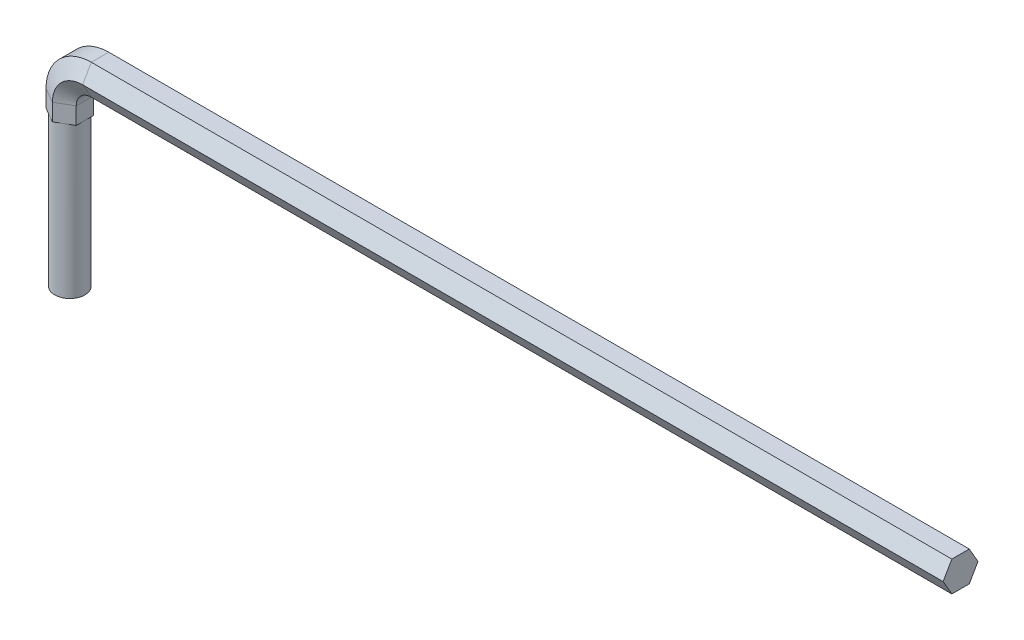
ISO-10303-21;
HEADER;
FILE_DESCRIPTION(('STEP AP214'),'2;1');
FILE_NAME('part.step','',(''),(''),'','','');
FILE_SCHEMA(('AUTOMOTIVE_DESIGN { 1 0 10303 214 1 1 1 1 }'));
ENDSEC;
DATA;
#1=APPLICATION_CONTEXT('core data for automotive mechanical design processes');
#2=APPLICATION_PROTOCOL_DEFINITION('international standard','automotive_design',2000,#1);
#3=PRODUCT_CONTEXT('',#1,'mechanical');
#4=PRODUCT('Part','Part','',(#3));
#5=PRODUCT_RELATED_PRODUCT_CATEGORY('part','',(#4));
#6=PRODUCT_DEFINITION_FORMATION('','',#4);
#7=PRODUCT_DEFINITION_CONTEXT('part definition',#1,'design');
#8=PRODUCT_DEFINITION('design','',#6,#7);
#9=PRODUCT_DEFINITION_SHAPE('','',#8);
#10=(LENGTH_UNIT() NAMED_UNIT(*) SI_UNIT(.MILLI.,.METRE.));
#11=(NAMED_UNIT(*) PLANE_ANGLE_UNIT() SI_UNIT($,.RADIAN.));
#12=(NAMED_UNIT(*) SI_UNIT($,.STERADIAN.) SOLID_ANGLE_UNIT());
#13=UNCERTAINTY_MEASURE_WITH_UNIT(LENGTH_MEASURE(1.E-05),#10,'distance_accuracy_value','');
#14=(GEOMETRIC_REPRESENTATION_CONTEXT(3) GLOBAL_UNCERTAINTY_ASSIGNED_CONTEXT((#13)) GLOBAL_UNIT_ASSIGNED_CONTEXT((#10,
#11,#12)) REPRESENTATION_CONTEXT('',''));
#15=CARTESIAN_POINT('',(0.,0.,0.));
#16=DIRECTION('',(0.,0.,1.));
#17=DIRECTION('',(1.,0.,0.));
#18=AXIS2_PLACEMENT_3D('',#15,#16,#17);
#19=CARTESIAN_POINT('',(-2.,-4.,1.15470053837925));
#20=DIRECTION('',(-1.,0.,0.));
#21=DIRECTION('',(0.,0.,1.));
#22=AXIS2_PLACEMENT_3D('',#19,#20,#21);
#23=PLANE('',#22);
#24=DIRECTION('',(0.,-1.,0.));
#25=VECTOR('',#24,1.);
#26=CARTESIAN_POINT('',(-2.,-4.,-1.15470053837925));
#27=LINE('',#26,#25);
#28=CARTESIAN_POINT('',(-2.,-4.,-1.15470053837925));
#29=VERTEX_POINT('',#28);
#30=CARTESIAN_POINT('',(-2.,-6.25,-1.15470053837925));
#31=VERTEX_POINT('',#30);
#32=EDGE_CURVE('E300',#29,#31,#27,.T.);
#33=ORIENTED_EDGE('',*,*,#32,.T.);
#34=DIRECTION('',(0.,0.,1.));
#35=VECTOR('',#34,1.);
#36=CARTESIAN_POINT('',(-2.,-6.25,1.15470053837925));
#37=LINE('',#36,#35);
#38=CARTESIAN_POINT('',(-2.,-6.25,0.));
#39=VERTEX_POINT('',#38);
#40=EDGE_CURVE('E398',#31,#39,#37,.T.);
#41=ORIENTED_EDGE('',*,*,#40,.T.);
#42=CARTESIAN_POINT('',(-2.,-6.25,1.15470053837925));
#43=VERTEX_POINT('',#42);
#44=EDGE_CURVE('E438',#39,#43,#37,.T.);
#45=ORIENTED_EDGE('',*,*,#44,.T.);
#46=DIRECTION('',(0.,-1.,0.));
#47=VECTOR('',#46,1.);
#48=CARTESIAN_POINT('',(-2.,-4.,1.15470053837925));
#49=LINE('',#48,#47);
#50=CARTESIAN_POINT('',(-2.,-4.,1.15470053837925));
#51=VERTEX_POINT('',#50);
#52=EDGE_CURVE('E263',#51,#43,#49,.T.);
#53=ORIENTED_EDGE('',*,*,#52,.F.);
#54=DIRECTION('',(0.,0.,-1.));
#55=VECTOR('',#54,1.);
#56=CARTESIAN_POINT('',(-2.00000000000017,-4.,1.15470053837925));
#57=LINE('',#56,#55);
#58=EDGE_CURVE('E267',#51,#29,#57,.T.);
#59=ORIENTED_EDGE('',*,*,#58,.T.);
#60=EDGE_LOOP('',(#33,#41,#45,#53,#59));
#61=FACE_BOUND('',#60,.T.);
#62=ADVANCED_FACE('F74',(#61),#23,.T.);
#63=CARTESIAN_POINT('',(-2.,-4.,-1.15470053837925));
#64=DIRECTION('',(-0.5,0.,-0.866025403784439));
#65=DIRECTION('',(-0.866025403784439,0.,0.5));
#66=AXIS2_PLACEMENT_3D('',#63,#64,#65);
#67=PLANE('',#66);
#68=DIRECTION('',(0.,-1.,0.));
#69=VECTOR('',#68,1.);
#70=CARTESIAN_POINT('',(0.,-4.,-2.30940107675851));
#71=LINE('',#70,#69);
#72=CARTESIAN_POINT('',(0.,-4.,-2.30940107675851));
#73=VERTEX_POINT('',#72);
#74=CARTESIAN_POINT('',(0.,-6.25,-2.3094010767585));
#75=VERTEX_POINT('',#74);
#76=EDGE_CURVE('E296',#73,#75,#71,.T.);
#77=ORIENTED_EDGE('',*,*,#76,.T.);
#78=DIRECTION('',(-0.866025403784439,0.,0.5));
#79=VECTOR('',#78,1.);
#80=CARTESIAN_POINT('',(-2.,-6.25,-1.15470053837925));
#81=LINE('',#80,#79);
#82=CARTESIAN_POINT('',(-1.,-6.25,-1.73205080756888));
#83=VERTEX_POINT('',#82);
#84=EDGE_CURVE('E210',#75,#83,#81,.T.);
#85=ORIENTED_EDGE('',*,*,#84,.T.);
#86=EDGE_CURVE('E251',#83,#31,#81,.T.);
#87=ORIENTED_EDGE('',*,*,#86,.T.);
#88=ORIENTED_EDGE('',*,*,#32,.F.);
#89=DIRECTION('',(0.866025403784439,0.,-0.5));
#90=VECTOR('',#89,1.);
#91=CARTESIAN_POINT('',(-2.00000000000017,-4.,-1.15470053837925));
#92=LINE('',#91,#90);
#93=EDGE_CURVE('E272',#29,#73,#92,.T.);
#94=ORIENTED_EDGE('',*,*,#93,.T.);
#95=EDGE_LOOP('',(#77,#85,#87,#88,#94));
#96=FACE_BOUND('',#95,.T.);
#97=ADVANCED_FACE('F393',(#96),#67,.T.);
#98=CARTESIAN_POINT('',(0.,-4.,-2.30940107675851));
#99=DIRECTION('',(0.5,0.,-0.866025403784439));
#100=DIRECTION('',(0.,-1.,0.));
#101=AXIS2_PLACEMENT_3D('',#98,#99,#100);
#102=PLANE('',#101);
#103=DIRECTION('',(0.,-1.,0.));
#104=VECTOR('',#103,1.);
#105=CARTESIAN_POINT('',(2.,-4.,-1.15470053837925));
#106=LINE('',#105,#104);
#107=CARTESIAN_POINT('',(2.,-4.,-1.15470053837925));
#108=VERTEX_POINT('',#107);
#109=CARTESIAN_POINT('',(2.,-6.25,-1.15470053837925));
#110=VERTEX_POINT('',#109);
#111=EDGE_CURVE('E242',#108,#110,#106,.T.);
#112=ORIENTED_EDGE('',*,*,#111,.T.);
#113=DIRECTION('',(-0.866025403784439,0.,-0.5));
#114=VECTOR('',#113,1.);
#115=CARTESIAN_POINT('',(0.,-6.25,-2.30940107675851));
#116=LINE('',#115,#114);
#117=CARTESIAN_POINT('',(1.,-6.25,-1.73205080756888));
#118=VERTEX_POINT('',#117);
#119=EDGE_CURVE('E216',#110,#118,#116,.T.);
#120=ORIENTED_EDGE('',*,*,#119,.T.);
#121=EDGE_CURVE('E204',#118,#75,#116,.T.);
#122=ORIENTED_EDGE('',*,*,#121,.T.);
#123=ORIENTED_EDGE('',*,*,#76,.F.);
#124=DIRECTION('',(0.866025403784439,0.,0.5));
#125=VECTOR('',#124,1.);
#126=CARTESIAN_POINT('',(-1.67984596668842E-13,-4.,-2.30940107675851));
#127=LINE('',#126,#125);
#128=EDGE_CURVE('E304',#73,#108,#127,.T.);
#129=ORIENTED_EDGE('',*,*,#128,.T.);
#130=EDGE_LOOP('',(#112,#120,#122,#123,#129));
#131=FACE_BOUND('',#130,.T.);
#132=ADVANCED_FACE('F239',(#131),#102,.T.);
#133=CARTESIAN_POINT('',(2.,-4.,-1.15470053837925));
#134=DIRECTION('',(1.,0.,0.));
#135=DIRECTION('',(0.,1.,0.));
#136=AXIS2_PLACEMENT_3D('',#133,#134,#135);
#137=PLANE('',#136);
#138=DIRECTION('',(0.,-1.,0.));
#139=VECTOR('',#138,1.);
#140=CARTESIAN_POINT('',(2.,-4.,1.15470053837925));
#141=LINE('',#140,#139);
#142=CARTESIAN_POINT('',(2.,-4.,1.15470053837925));
#143=VERTEX_POINT('',#142);
#144=CARTESIAN_POINT('',(2.,-6.25,1.15470053837925));
#145=VERTEX_POINT('',#144);
#146=EDGE_CURVE('E258',#143,#145,#141,.T.);
#147=ORIENTED_EDGE('',*,*,#146,.T.);
#148=DIRECTION('',(0.,0.,-1.));
#149=VECTOR('',#148,1.);
#150=CARTESIAN_POINT('',(2.,-6.25,-1.15470053837925));
#151=LINE('',#150,#149);
#152=CARTESIAN_POINT('',(2.,-6.25,0.));
#153=VERTEX_POINT('',#152);
#154=EDGE_CURVE('E425',#145,#153,#151,.T.);
#155=ORIENTED_EDGE('',*,*,#154,.T.);
#156=EDGE_CURVE('E217',#153,#110,#151,.T.);
#157=ORIENTED_EDGE('',*,*,#156,.T.);
#158=ORIENTED_EDGE('',*,*,#111,.F.);
#159=DIRECTION('',(0.,0.,1.));
#160=VECTOR('',#159,1.);
#161=CARTESIAN_POINT('',(1.99999999999983,-4.,-1.15470053837925));
#162=LINE('',#161,#160);
#163=EDGE_CURVE('E286',#108,#143,#162,.T.);
#164=ORIENTED_EDGE('',*,*,#163,.T.);
#165=EDGE_LOOP('',(#147,#155,#157,#158,#164));
#166=FACE_BOUND('',#165,.T.);
#167=ADVANCED_FACE('F424',(#166),#137,.T.);
#168=CARTESIAN_POINT('',(2.,-4.,1.15470053837925));
#169=DIRECTION('',(0.5,0.,0.866025403784439));
#170=DIRECTION('',(0.,-1.,0.));
#171=AXIS2_PLACEMENT_3D('',#168,#169,#170);
#172=PLANE('',#171);
#173=DIRECTION('',(0.,-1.,0.));
#174=VECTOR('',#173,1.);
#175=CARTESIAN_POINT('',(0.,-4.,2.30940107675851));
#176=LINE('',#175,#174);
#177=CARTESIAN_POINT('',(0.,-4.,2.30940107675851));
#178=VERTEX_POINT('',#177);
#179=CARTESIAN_POINT('',(0.,-6.25,2.30940107675851));
#180=VERTEX_POINT('',#179);
#181=EDGE_CURVE('E244',#178,#180,#176,.T.);
#182=ORIENTED_EDGE('',*,*,#181,.T.);
#183=DIRECTION('',(0.866025403784439,0.,-0.5));
#184=VECTOR('',#183,1.);
#185=CARTESIAN_POINT('',(2.,-6.25,1.15470053837925));
#186=LINE('',#185,#184);
#187=CARTESIAN_POINT('',(1.,-6.25,1.73205080756888));
#188=VERTEX_POINT('',#187);
#189=EDGE_CURVE('E90',#180,#188,#186,.T.);
#190=ORIENTED_EDGE('',*,*,#189,.T.);
#191=EDGE_CURVE('E430',#188,#145,#186,.T.);
#192=ORIENTED_EDGE('',*,*,#191,.T.);
#193=ORIENTED_EDGE('',*,*,#146,.F.);
#194=DIRECTION('',(-0.866025403784439,0.,0.5));
#195=VECTOR('',#194,1.);
#196=CARTESIAN_POINT('',(1.99999999999983,-4.,1.15470053837925));
#197=LINE('',#196,#195);
#198=EDGE_CURVE('E262',#143,#178,#197,.T.);
#199=ORIENTED_EDGE('',*,*,#198,.T.);
#200=EDGE_LOOP('',(#182,#190,#192,#193,#199));
#201=FACE_BOUND('',#200,.T.);
#202=ADVANCED_FACE('F453',(#201),#172,.T.);
#203=CARTESIAN_POINT('',(0.,-4.,2.30940107675851));
#204=DIRECTION('',(-0.5,0.,0.866025403784439));
#205=DIRECTION('',(0.,1.,0.));
#206=AXIS2_PLACEMENT_3D('',#203,#204,#205);
#207=PLANE('',#206);
#208=ORIENTED_EDGE('',*,*,#52,.T.);
#209=DIRECTION('',(0.866025403784439,0.,0.5));
#210=VECTOR('',#209,1.);
#211=CARTESIAN_POINT('',(0.,-6.25,2.30940107675851));
#212=LINE('',#211,#210);
#213=CARTESIAN_POINT('',(-1.,-6.25,1.73205080756888));
#214=VERTEX_POINT('',#213);
#215=EDGE_CURVE('E13',#43,#214,#212,.T.);
#216=ORIENTED_EDGE('',*,*,#215,.T.);
#217=EDGE_CURVE('E78',#214,#180,#212,.T.);
#218=ORIENTED_EDGE('',*,*,#217,.T.);
#219=ORIENTED_EDGE('',*,*,#181,.F.);
#220=DIRECTION('',(-0.866025403784439,0.,-0.5));
#221=VECTOR('',#220,1.);
#222=CARTESIAN_POINT('',(-1.65475338807062E-13,-4.,2.30940107675851));
#223=LINE('',#222,#221);
#224=EDGE_CURVE('E247',#178,#51,#223,.T.);
#225=ORIENTED_EDGE('',*,*,#224,.T.);
#226=EDGE_LOOP('',(#208,#216,#218,#219,#225));
#227=FACE_BOUND('',#226,.T.);
#228=ADVANCED_FACE('F445',(#227),#207,.T.);
#229=CARTESIAN_POINT('',(117.9,0.,0.));
#230=DIRECTION('',(-1.,0.,0.));
#231=DIRECTION('',(0.,0.,1.));
#232=AXIS2_PLACEMENT_3D('',#229,#230,#231);
#233=PLANE('',#232);
#234=DIRECTION('',(0.,0.,-1.));
#235=VECTOR('',#234,1.);
#236=CARTESIAN_POINT('',(117.9,2.,1.15470053837925));
#237=LINE('',#236,#235);
#238=CARTESIAN_POINT('',(117.9,2.,1.15470053837925));
#239=VERTEX_POINT('',#238);
#240=CARTESIAN_POINT('',(117.9,2.,-1.15470053837925));
#241=VERTEX_POINT('',#240);
#242=EDGE_CURVE('E103',#239,#241,#237,.T.);
#243=ORIENTED_EDGE('',*,*,#242,.F.);
#244=DIRECTION('',(0.,0.866025403784439,-0.5));
#245=VECTOR('',#244,1.);
#246=CARTESIAN_POINT('',(117.9,0.,2.30940107675851));
#247=LINE('',#246,#245);
#248=CARTESIAN_POINT('',(117.9,0.,2.30940107675851));
#249=VERTEX_POINT('',#248);
#250=EDGE_CURVE('E329',#249,#239,#247,.T.);
#251=ORIENTED_EDGE('',*,*,#250,.F.);
#252=DIRECTION('',(0.,0.866025403784439,0.5));
#253=VECTOR('',#252,1.);
#254=CARTESIAN_POINT('',(117.9,-2.,1.15470053837925));
#255=LINE('',#254,#253);
#256=CARTESIAN_POINT('',(117.9,-2.,1.15470053837925));
#257=VERTEX_POINT('',#256);
#258=EDGE_CURVE('E359',#257,#249,#255,.T.);
#259=ORIENTED_EDGE('',*,*,#258,.F.);
#260=DIRECTION('',(0.,0.,1.));
#261=VECTOR('',#260,1.);
#262=CARTESIAN_POINT('',(117.9,-2.,-1.15470053837925));
#263=LINE('',#262,#261);
#264=CARTESIAN_POINT('',(117.9,-2.,-1.15470053837925));
#265=VERTEX_POINT('',#264);
#266=EDGE_CURVE('E253',#265,#257,#263,.T.);
#267=ORIENTED_EDGE('',*,*,#266,.F.);
#268=DIRECTION('',(0.,-0.866025403784439,0.5));
#269=VECTOR('',#268,1.);
#270=CARTESIAN_POINT('',(117.9,0.,-2.30940107675851));
#271=LINE('',#270,#269);
#272=CARTESIAN_POINT('',(117.9,0.,-2.30940107675851));
#273=VERTEX_POINT('',#272);
#274=EDGE_CURVE('E283',#273,#265,#271,.T.);
#275=ORIENTED_EDGE('',*,*,#274,.F.);
#276=DIRECTION('',(0.,-0.866025403784439,-0.5));
#277=VECTOR('',#276,1.);
#278=CARTESIAN_POINT('',(117.9,2.,-1.15470053837925));
#279=LINE('',#278,#277);
#280=EDGE_CURVE('E282',#241,#273,#279,.T.);
#281=ORIENTED_EDGE('',*,*,#280,.F.);
#282=EDGE_LOOP('',(#243,#251,#259,#267,#275,#281));
#283=FACE_BOUND('',#282,.T.);
#284=ADVANCED_FACE('F76',(#283),#233,.F.);
#285=CARTESIAN_POINT('',(117.9,2.,1.15470053837925));
#286=DIRECTION('',(0.,1.,0.));
#287=DIRECTION('',(0.,0.,-1.));
#288=AXIS2_PLACEMENT_3D('',#285,#286,#287);
#289=PLANE('',#288);
#290=DIRECTION('',(-1.,0.,0.));
#291=VECTOR('',#290,1.);
#292=CARTESIAN_POINT('',(117.9,2.,-1.15470053837925));
#293=LINE('',#292,#291);
#294=CARTESIAN_POINT('',(4.,2.,-1.15470053837925));
#295=VERTEX_POINT('',#294);
#296=EDGE_CURVE('E279',#241,#295,#293,.T.);
#297=ORIENTED_EDGE('',*,*,#296,.T.);
#298=DIRECTION('',(0.,0.,-1.));
#299=VECTOR('',#298,1.);
#300=CARTESIAN_POINT('',(4.,2.,1.15470053837925));
#301=LINE('',#300,#299);
#302=CARTESIAN_POINT('',(4.,2.,1.15470053837925));
#303=VERTEX_POINT('',#302);
#304=EDGE_CURVE('E347',#303,#295,#301,.T.);
#305=ORIENTED_EDGE('',*,*,#304,.F.);
#306=DIRECTION('',(-1.,0.,0.));
#307=VECTOR('',#306,1.);
#308=CARTESIAN_POINT('',(117.9,2.,1.15470053837925));
#309=LINE('',#308,#307);
#310=EDGE_CURVE('E325',#239,#303,#309,.T.);
#311=ORIENTED_EDGE('',*,*,#310,.F.);
#312=ORIENTED_EDGE('',*,*,#242,.T.);
#313=EDGE_LOOP('',(#297,#305,#311,#312));
#314=FACE_BOUND('',#313,.T.);
#315=ADVANCED_FACE('F405',(#314),#289,.T.);
#316=CARTESIAN_POINT('',(117.9,2.,-1.15470053837925));
#317=DIRECTION('',(0.,0.5,-0.866025403784439));
#318=DIRECTION('',(-1.,0.,0.));
#319=AXIS2_PLACEMENT_3D('',#316,#317,#318);
#320=PLANE('',#319);
#321=DIRECTION('',(-1.,0.,0.));
#322=VECTOR('',#321,1.);
#323=CARTESIAN_POINT('',(117.9,0.,-2.30940107675851));
#324=LINE('',#323,#322);
#325=CARTESIAN_POINT('',(4.,0.,-2.30940107675851));
#326=VERTEX_POINT('',#325);
#327=EDGE_CURVE('E255',#273,#326,#324,.T.);
#328=ORIENTED_EDGE('',*,*,#327,.T.);
#329=DIRECTION('',(0.,-0.866025403784439,-0.5));
#330=VECTOR('',#329,1.);
#331=CARTESIAN_POINT('',(4.,2.,-1.15470053837925));
#332=LINE('',#331,#330);
#333=EDGE_CURVE('E343',#295,#326,#332,.T.);
#334=ORIENTED_EDGE('',*,*,#333,.F.);
#335=ORIENTED_EDGE('',*,*,#296,.F.);
#336=ORIENTED_EDGE('',*,*,#280,.T.);
#337=EDGE_LOOP('',(#328,#334,#335,#336));
#338=FACE_BOUND('',#337,.T.);
#339=ADVANCED_FACE('F372',(#338),#320,.T.);
#340=CARTESIAN_POINT('',(117.9,0.,-2.30940107675851));
#341=DIRECTION('',(0.,-0.5,-0.866025403784439));
#342=DIRECTION('',(0.,-0.866025403784439,0.5));
#343=AXIS2_PLACEMENT_3D('',#340,#341,#342);
#344=PLANE('',#343);
#345=DIRECTION('',(-1.,0.,0.));
#346=VECTOR('',#345,1.);
#347=CARTESIAN_POINT('',(117.9,-2.,-1.15470053837925));
#348=LINE('',#347,#346);
#349=CARTESIAN_POINT('',(4.,-2.,-1.15470053837925));
#350=VERTEX_POINT('',#349);
#351=EDGE_CURVE('E256',#265,#350,#348,.T.);
#352=ORIENTED_EDGE('',*,*,#351,.T.);
#353=DIRECTION('',(0.,-0.866025403784439,0.5));
#354=VECTOR('',#353,1.);
#355=CARTESIAN_POINT('',(4.,0.,-2.30940107675851));
#356=LINE('',#355,#354);
#357=EDGE_CURVE('E334',#326,#350,#356,.T.);
#358=ORIENTED_EDGE('',*,*,#357,.F.);
#359=ORIENTED_EDGE('',*,*,#327,.F.);
#360=ORIENTED_EDGE('',*,*,#274,.T.);
#361=EDGE_LOOP('',(#352,#358,#359,#360));
#362=FACE_BOUND('',#361,.T.);
#363=ADVANCED_FACE('F381',(#362),#344,.T.);
#364=CARTESIAN_POINT('',(117.9,-2.,-1.15470053837925));
#365=DIRECTION('',(0.,-1.,0.));
#366=DIRECTION('',(0.,0.,-1.));
#367=AXIS2_PLACEMENT_3D('',#364,#365,#366);
#368=PLANE('',#367);
#369=DIRECTION('',(-1.,0.,0.));
#370=VECTOR('',#369,1.);
#371=CARTESIAN_POINT('',(117.9,-2.,1.15470053837925));
#372=LINE('',#371,#370);
#373=CARTESIAN_POINT('',(4.,-2.,1.15470053837925));
#374=VERTEX_POINT('',#373);
#375=EDGE_CURVE('E328',#257,#374,#372,.T.);
#376=ORIENTED_EDGE('',*,*,#375,.T.);
#377=DIRECTION('',(0.,0.,1.));
#378=VECTOR('',#377,1.);
#379=CARTESIAN_POINT('',(4.,-2.,-1.15470053837925));
#380=LINE('',#379,#378);
#381=EDGE_CURVE('E287',#350,#374,#380,.T.);
#382=ORIENTED_EDGE('',*,*,#381,.F.);
#383=ORIENTED_EDGE('',*,*,#351,.F.);
#384=ORIENTED_EDGE('',*,*,#266,.T.);
#385=EDGE_LOOP('',(#376,#382,#383,#384));
#386=FACE_BOUND('',#385,.T.);
#387=ADVANCED_FACE('F417',(#386),#368,.T.);
#388=CARTESIAN_POINT('',(117.9,-2.,1.15470053837925));
#389=DIRECTION('',(0.,-0.5,0.866025403784439));
#390=DIRECTION('',(-1.,0.,0.));
#391=AXIS2_PLACEMENT_3D('',#388,#389,#390);
#392=PLANE('',#391);
#393=DIRECTION('',(-1.,0.,0.));
#394=VECTOR('',#393,1.);
#395=CARTESIAN_POINT('',(117.9,0.,2.30940107675851));
#396=LINE('',#395,#394);
#397=CARTESIAN_POINT('',(4.,0.,2.30940107675851));
#398=VERTEX_POINT('',#397);
#399=EDGE_CURVE('E351',#249,#398,#396,.T.);
#400=ORIENTED_EDGE('',*,*,#399,.T.);
#401=DIRECTION('',(0.,0.866025403784439,0.5));
#402=VECTOR('',#401,1.);
#403=CARTESIAN_POINT('',(4.,-2.,1.15470053837925));
#404=LINE('',#403,#402);
#405=EDGE_CURVE('E321',#374,#398,#404,.T.);
#406=ORIENTED_EDGE('',*,*,#405,.F.);
#407=ORIENTED_EDGE('',*,*,#375,.F.);
#408=ORIENTED_EDGE('',*,*,#258,.T.);
#409=EDGE_LOOP('',(#400,#406,#407,#408));
#410=FACE_BOUND('',#409,.T.);
#411=ADVANCED_FACE('F414',(#410),#392,.T.);
#412=CARTESIAN_POINT('',(117.9,0.,2.30940107675851));
#413=DIRECTION('',(0.,0.5,0.866025403784439));
#414=DIRECTION('',(1.,0.,0.));
#415=AXIS2_PLACEMENT_3D('',#412,#413,#414);
#416=PLANE('',#415);
#417=DIRECTION('',(0.,0.866025403784439,-0.5));
#418=VECTOR('',#417,1.);
#419=CARTESIAN_POINT('',(4.,0.,2.30940107675851));
#420=LINE('',#419,#418);
#421=EDGE_CURVE('E311',#398,#303,#420,.T.);
#422=ORIENTED_EDGE('',*,*,#421,.F.);
#423=ORIENTED_EDGE('',*,*,#399,.F.);
#424=ORIENTED_EDGE('',*,*,#250,.T.);
#425=ORIENTED_EDGE('',*,*,#310,.T.);
#426=EDGE_LOOP('',(#422,#423,#424,#425));
#427=FACE_BOUND('',#426,.T.);
#428=ADVANCED_FACE('F410',(#427),#416,.T.);
#429=CARTESIAN_POINT('',(4.,-4.,0.));
#430=DIRECTION('',(0.,0.,1.));
#431=DIRECTION('',(1.,0.,0.));
#432=AXIS2_PLACEMENT_3D('',#429,#430,#431);
#433=CYLINDRICAL_SURFACE('',#432,6.);
#434=CARTESIAN_POINT('',(4.,-4.,-1.15470053837925));
#435=DIRECTION('',(0.,0.,1.));
#436=DIRECTION('',(0.,1.,0.));
#437=AXIS2_PLACEMENT_3D('',#434,#435,#436);
#438=CIRCLE('',#437,6.);
#439=EDGE_CURVE('E338',#295,#29,#438,.T.);
#440=ORIENTED_EDGE('',*,*,#439,.T.);
#441=ORIENTED_EDGE('',*,*,#58,.F.);
#442=CARTESIAN_POINT('',(4.,-4.,1.15470053837925));
#443=DIRECTION('',(0.,0.,1.));
#444=DIRECTION('',(0.,1.,0.));
#445=AXIS2_PLACEMENT_3D('',#442,#443,#444);
#446=CIRCLE('',#445,6.);
#447=EDGE_CURVE('E315',#303,#51,#446,.T.);
#448=ORIENTED_EDGE('',*,*,#447,.F.);
#449=ORIENTED_EDGE('',*,*,#304,.T.);
#450=EDGE_LOOP('',(#440,#441,#448,#449));
#451=FACE_BOUND('',#450,.T.);
#452=ADVANCED_FACE('F403',(#451),#433,.T.);
#453=CARTESIAN_POINT('',(4.,-4.,-1.15470053837925));
#454=DIRECTION('',(0.,0.,1.));
#455=DIRECTION('',(1.,0.,0.));
#456=AXIS2_PLACEMENT_3D('',#453,#454,#455);
#457=CONICAL_SURFACE('',#456,6.,1.0471975511966);
#458=CARTESIAN_POINT('',(4.,-4.,-2.30940107675851));
#459=DIRECTION('',(0.,0.,1.));
#460=DIRECTION('',(0.,1.,0.));
#461=AXIS2_PLACEMENT_3D('',#458,#459,#460);
#462=CIRCLE('',#461,4.);
#463=EDGE_CURVE('E291',#326,#73,#462,.T.);
#464=ORIENTED_EDGE('',*,*,#463,.T.);
#465=ORIENTED_EDGE('',*,*,#93,.F.);
#466=ORIENTED_EDGE('',*,*,#439,.F.);
#467=ORIENTED_EDGE('',*,*,#333,.T.);
#468=EDGE_LOOP('',(#464,#465,#466,#467));
#469=FACE_BOUND('',#468,.T.);
#470=ADVANCED_FACE('F389',(#469),#457,.T.);
#471=CARTESIAN_POINT('',(4.,-4.,-2.30940107675851));
#472=DIRECTION('',(0.,0.,-1.));
#473=DIRECTION('',(-1.,0.,0.));
#474=AXIS2_PLACEMENT_3D('',#471,#472,#473);
#475=CONICAL_SURFACE('',#474,4.,1.0471975511966);
#476=CARTESIAN_POINT('',(4.,-4.,-1.15470053837925));
#477=DIRECTION('',(0.,0.,1.));
#478=DIRECTION('',(0.,1.,0.));
#479=AXIS2_PLACEMENT_3D('',#476,#477,#478);
#480=CIRCLE('',#479,2.);
#481=EDGE_CURVE('E292',#350,#108,#480,.T.);
#482=ORIENTED_EDGE('',*,*,#481,.T.);
#483=ORIENTED_EDGE('',*,*,#128,.F.);
#484=ORIENTED_EDGE('',*,*,#463,.F.);
#485=ORIENTED_EDGE('',*,*,#357,.T.);
#486=EDGE_LOOP('',(#482,#483,#484,#485));
#487=FACE_BOUND('',#486,.T.);
#488=ADVANCED_FACE('F386',(#487),#475,.F.);
#489=CARTESIAN_POINT('',(4.,-4.,0.));
#490=DIRECTION('',(0.,0.,1.));
#491=DIRECTION('',(1.,0.,0.));
#492=AXIS2_PLACEMENT_3D('',#489,#490,#491);
#493=CYLINDRICAL_SURFACE('',#492,2.);
#494=CARTESIAN_POINT('',(4.,-4.,1.15470053837925));
#495=DIRECTION('',(0.,0.,1.));
#496=DIRECTION('',(0.,1.,0.));
#497=AXIS2_PLACEMENT_3D('',#494,#495,#496);
#498=CIRCLE('',#497,2.);
#499=EDGE_CURVE('E318',#374,#143,#498,.T.);
#500=ORIENTED_EDGE('',*,*,#499,.T.);
#501=ORIENTED_EDGE('',*,*,#163,.F.);
#502=ORIENTED_EDGE('',*,*,#481,.F.);
#503=ORIENTED_EDGE('',*,*,#381,.T.);
#504=EDGE_LOOP('',(#500,#501,#502,#503));
#505=FACE_BOUND('',#504,.T.);
#506=ADVANCED_FACE('F420',(#505),#493,.F.);
#507=CARTESIAN_POINT('',(4.,-4.,1.15470053837925));
#508=DIRECTION('',(0.,0.,1.));
#509=DIRECTION('',(1.,0.,0.));
#510=AXIS2_PLACEMENT_3D('',#507,#508,#509);
#511=CONICAL_SURFACE('',#510,2.,1.0471975511966);
#512=CARTESIAN_POINT('',(4.,-4.,2.30940107675851));
#513=DIRECTION('',(0.,0.,1.));
#514=DIRECTION('',(0.,1.,0.));
#515=AXIS2_PLACEMENT_3D('',#512,#513,#514);
#516=CIRCLE('',#515,4.);
#517=EDGE_CURVE('E271',#398,#178,#516,.T.);
#518=ORIENTED_EDGE('',*,*,#517,.T.);
#519=ORIENTED_EDGE('',*,*,#198,.F.);
#520=ORIENTED_EDGE('',*,*,#499,.F.);
#521=ORIENTED_EDGE('',*,*,#405,.T.);
#522=EDGE_LOOP('',(#518,#519,#520,#521));
#523=FACE_BOUND('',#522,.T.);
#524=ADVANCED_FACE('F452',(#523),#511,.F.);
#525=CARTESIAN_POINT('',(4.,-4.,2.30940107675851));
#526=DIRECTION('',(0.,0.,-1.));
#527=DIRECTION('',(-1.,0.,0.));
#528=AXIS2_PLACEMENT_3D('',#525,#526,#527);
#529=CONICAL_SURFACE('',#528,4.,1.0471975511966);
#530=ORIENTED_EDGE('',*,*,#224,.F.);
#531=ORIENTED_EDGE('',*,*,#517,.F.);
#532=ORIENTED_EDGE('',*,*,#421,.T.);
#533=ORIENTED_EDGE('',*,*,#447,.T.);
#534=EDGE_LOOP('',(#530,#531,#532,#533));
#535=FACE_BOUND('',#534,.T.);
#536=ADVANCED_FACE('F450',(#535),#529,.T.);
#537=CARTESIAN_POINT('',(57.95,-6.25,0.));
#538=DIRECTION('',(0.,-1.,0.));
#539=DIRECTION('',(0.,0.,-1.));
#540=AXIS2_PLACEMENT_3D('',#537,#538,#539);
#541=PLANE('',#540);
#542=ORIENTED_EDGE('',*,*,#156,.F.);
#543=CARTESIAN_POINT('',(0.,-6.25,0.));
#544=DIRECTION('',(0.,-1.,0.));
#545=DIRECTION('',(0.,0.,-1.));
#546=AXIS2_PLACEMENT_3D('',#543,#544,#545);
#547=CIRCLE('',#546,2.);
#548=EDGE_CURVE('E225',#118,#153,#547,.T.);
#549=ORIENTED_EDGE('',*,*,#548,.F.);
#550=ORIENTED_EDGE('',*,*,#119,.F.);
#551=EDGE_LOOP('',(#542,#549,#550));
#552=FACE_BOUND('',#551,.T.);
#553=ADVANCED_FACE('F233',(#552),#541,.T.);
#554=EDGE_CURVE('E207',#83,#118,#547,.T.);
#555=ORIENTED_EDGE('',*,*,#554,.F.);
#556=ORIENTED_EDGE('',*,*,#84,.F.);
#557=ORIENTED_EDGE('',*,*,#121,.F.);
#558=EDGE_LOOP('',(#555,#556,#557));
#559=FACE_BOUND('',#558,.T.);
#560=ADVANCED_FACE('F206',(#559),#541,.T.);
#561=EDGE_CURVE('E228',#39,#83,#547,.T.);
#562=ORIENTED_EDGE('',*,*,#561,.F.);
#563=ORIENTED_EDGE('',*,*,#40,.F.);
#564=ORIENTED_EDGE('',*,*,#86,.F.);
#565=EDGE_LOOP('',(#562,#563,#564));
#566=FACE_BOUND('',#565,.T.);
#567=ADVANCED_FACE('F761',(#566),#541,.T.);
#568=ORIENTED_EDGE('',*,*,#191,.F.);
#569=EDGE_CURVE('E237',#153,#188,#547,.T.);
#570=ORIENTED_EDGE('',*,*,#569,.F.);
#571=ORIENTED_EDGE('',*,*,#154,.F.);
#572=EDGE_LOOP('',(#568,#570,#571));
#573=FACE_BOUND('',#572,.T.);
#574=ADVANCED_FACE('F480',(#573),#541,.T.);
#575=EDGE_CURVE('E487',#214,#39,#547,.T.);
#576=ORIENTED_EDGE('',*,*,#575,.F.);
#577=ORIENTED_EDGE('',*,*,#215,.F.);
#578=ORIENTED_EDGE('',*,*,#44,.F.);
#579=EDGE_LOOP('',(#576,#577,#578));
#580=FACE_BOUND('',#579,.T.);
#581=ADVANCED_FACE('F474',(#580),#541,.T.);
#582=CARTESIAN_POINT('',(0.,-6.25,0.));
#583=DIRECTION('',(0.,-1.,0.));
#584=DIRECTION('',(0.,0.,-1.));
#585=AXIS2_PLACEMENT_3D('',#582,#583,#584);
#586=CYLINDRICAL_SURFACE('',#585,2.);
#587=CARTESIAN_POINT('',(0.,-26.25,0.));
#588=DIRECTION('',(0.,-1.,0.));
#589=DIRECTION('',(0.,0.,-1.));
#590=AXIS2_PLACEMENT_3D('',#587,#588,#589);
#591=CIRCLE('',#590,2.);
#592=CARTESIAN_POINT('',(0.,-26.25,-2.));
#593=VERTEX_POINT('',#592);
#594=EDGE_CURVE('E230',#593,#593,#591,.T.);
#595=ORIENTED_EDGE('',*,*,#594,.F.);
#596=EDGE_LOOP('',(#595));
#597=FACE_BOUND('',#596,.T.);
#598=ORIENTED_EDGE('',*,*,#575,.T.);
#599=ORIENTED_EDGE('',*,*,#561,.T.);
#600=ORIENTED_EDGE('',*,*,#554,.T.);
#601=ORIENTED_EDGE('',*,*,#548,.T.);
#602=ORIENTED_EDGE('',*,*,#569,.T.);
#603=EDGE_CURVE('E489',#188,#214,#547,.T.);
#604=ORIENTED_EDGE('',*,*,#603,.T.);
#605=EDGE_LOOP('',(#598,#599,#600,#601,#602,#604));
#606=FACE_BOUND('',#605,.T.);
#607=ADVANCED_FACE('F223',(#597,#606),#586,.T.);
#608=ORIENTED_EDGE('',*,*,#217,.F.);
#609=ORIENTED_EDGE('',*,*,#603,.F.);
#610=ORIENTED_EDGE('',*,*,#189,.F.);
#611=EDGE_LOOP('',(#608,#609,#610));
#612=FACE_BOUND('',#611,.T.);
#613=ADVANCED_FACE('F470',(#612),#541,.T.);
#614=CARTESIAN_POINT('',(0.,-26.25,0.));
#615=DIRECTION('',(0.,-1.,0.));
#616=DIRECTION('',(0.,0.,-1.));
#617=AXIS2_PLACEMENT_3D('',#614,#615,#616);
#618=PLANE('',#617);
#619=ORIENTED_EDGE('',*,*,#594,.T.);
#620=EDGE_LOOP('',(#619));
#621=FACE_BOUND('',#620,.T.);
#622=ADVANCED_FACE('F473',(#621),#618,.T.);
#623=CLOSED_SHELL('',(#62,#97,#132,#167,#202,#228,#284,#315,#339,#363,#387,#411,#428,#452,#470,
#488,#506,#524,#536,#553,#560,#567,#574,#581,#607,#613,#622));
#624=MANIFOLD_SOLID_BREP('B2',#623);
#625=ADVANCED_BREP_SHAPE_REPRESENTATION('',(#18,#624),#14);
#626=SHAPE_DEFINITION_REPRESENTATION(#9,#625);
ENDSEC;
END-ISO-10303-21;
